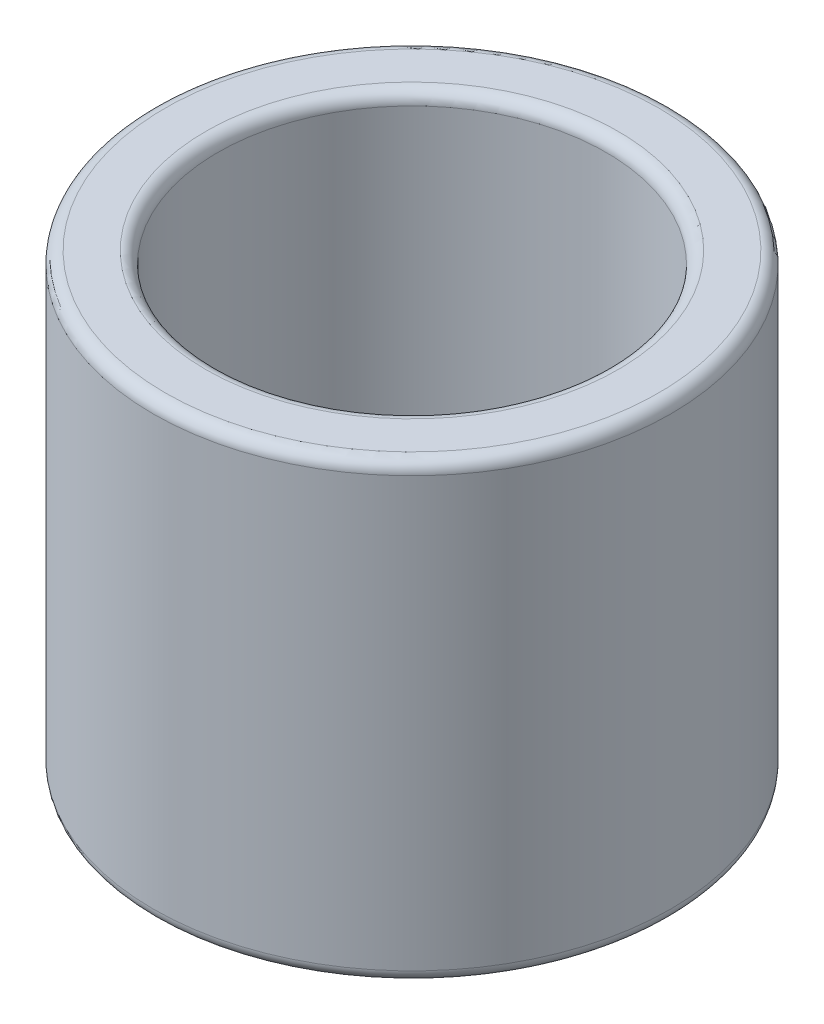
ISO-10303-21;
HEADER;
FILE_DESCRIPTION(('STEP AP214'),'2;1');
FILE_NAME('part.step','',(''),(''),'','','');
FILE_SCHEMA(('AUTOMOTIVE_DESIGN { 1 0 10303 214 1 1 1 1 }'));
ENDSEC;
DATA;
#1=APPLICATION_CONTEXT('core data for automotive mechanical design processes');
#2=APPLICATION_PROTOCOL_DEFINITION('international standard','automotive_design',2000,#1);
#3=PRODUCT_CONTEXT('',#1,'mechanical');
#4=PRODUCT('Part','Part','',(#3));
#5=PRODUCT_RELATED_PRODUCT_CATEGORY('part','',(#4));
#6=PRODUCT_DEFINITION_FORMATION('','',#4);
#7=PRODUCT_DEFINITION_CONTEXT('part definition',#1,'design');
#8=PRODUCT_DEFINITION('design','',#6,#7);
#9=PRODUCT_DEFINITION_SHAPE('','',#8);
#10=(LENGTH_UNIT() NAMED_UNIT(*) SI_UNIT(.MILLI.,.METRE.));
#11=(NAMED_UNIT(*) PLANE_ANGLE_UNIT() SI_UNIT($,.RADIAN.));
#12=(NAMED_UNIT(*) SI_UNIT($,.STERADIAN.) SOLID_ANGLE_UNIT());
#13=UNCERTAINTY_MEASURE_WITH_UNIT(LENGTH_MEASURE(1.E-05),#10,'distance_accuracy_value','');
#14=(GEOMETRIC_REPRESENTATION_CONTEXT(3) GLOBAL_UNCERTAINTY_ASSIGNED_CONTEXT((#13)) GLOBAL_UNIT_ASSIGNED_CONTEXT((#10,
#11,#12)) REPRESENTATION_CONTEXT('',''));
#15=CARTESIAN_POINT('',(0.,0.,0.));
#16=DIRECTION('',(0.,0.,1.));
#17=DIRECTION('',(1.,0.,0.));
#18=AXIS2_PLACEMENT_3D('',#15,#16,#17);
#19=CARTESIAN_POINT('',(0.,14.,0.));
#20=DIRECTION('',(0.,1.,0.));
#21=DIRECTION('',(0.,0.,1.));
#22=AXIS2_PLACEMENT_3D('',#19,#20,#21);
#23=PLANE('',#22);
#24=CARTESIAN_POINT('',(0.,14.,0.));
#25=DIRECTION('',(0.,1.,0.));
#26=DIRECTION('',(0.,0.,1.));
#27=AXIS2_PLACEMENT_3D('',#24,#25,#26);
#28=CIRCLE('',#27,12.75);
#29=CARTESIAN_POINT('',(0.,14.,12.75));
#30=VERTEX_POINT('',#29);
#31=EDGE_CURVE('E10',#30,#30,#28,.F.);
#32=ORIENTED_EDGE('',*,*,#31,.T.);
#33=EDGE_LOOP('',(#32));
#34=FACE_BOUND('',#33,.T.);
#35=CARTESIAN_POINT('',(0.,14.,0.));
#36=DIRECTION('',(0.,1.,0.));
#37=DIRECTION('',(0.,0.,1.));
#38=AXIS2_PLACEMENT_3D('',#35,#36,#37);
#39=CIRCLE('',#38,15.25);
#40=CARTESIAN_POINT('',(0.,14.,15.25));
#41=VERTEX_POINT('',#40);
#42=EDGE_CURVE('E45',#41,#41,#39,.T.);
#43=ORIENTED_EDGE('',*,*,#42,.T.);
#44=EDGE_LOOP('',(#43));
#45=FACE_BOUND('',#44,.T.);
#46=ADVANCED_FACE('F37',(#34,#45),#23,.T.);
#47=CARTESIAN_POINT('',(0.,-14.,0.));
#48=DIRECTION('',(0.,1.,0.));
#49=DIRECTION('',(0.,0.,1.));
#50=AXIS2_PLACEMENT_3D('',#47,#48,#49);
#51=PLANE('',#50);
#52=CARTESIAN_POINT('',(0.,-14.,0.));
#53=DIRECTION('',(0.,1.,0.));
#54=DIRECTION('',(0.,0.,1.));
#55=AXIS2_PLACEMENT_3D('',#52,#53,#54);
#56=CIRCLE('',#55,12.75);
#57=CARTESIAN_POINT('',(0.,-14.,12.75));
#58=VERTEX_POINT('',#57);
#59=EDGE_CURVE('E69',#58,#58,#56,.T.);
#60=ORIENTED_EDGE('',*,*,#59,.T.);
#61=EDGE_LOOP('',(#60));
#62=FACE_BOUND('',#61,.T.);
#63=CARTESIAN_POINT('',(0.,-14.,0.));
#64=DIRECTION('',(0.,1.,0.));
#65=DIRECTION('',(0.,0.,1.));
#66=AXIS2_PLACEMENT_3D('',#63,#64,#65);
#67=CIRCLE('',#66,15.25);
#68=CARTESIAN_POINT('',(0.,-14.,15.25));
#69=VERTEX_POINT('',#68);
#70=EDGE_CURVE('E73',#69,#69,#67,.F.);
#71=ORIENTED_EDGE('',*,*,#70,.T.);
#72=EDGE_LOOP('',(#71));
#73=FACE_BOUND('',#72,.T.);
#74=ADVANCED_FACE('F78',(#62,#73),#51,.F.);
#75=CARTESIAN_POINT('',(0.,14.,0.));
#76=DIRECTION('',(0.,-1.,0.));
#77=DIRECTION('',(0.,0.,-1.));
#78=AXIS2_PLACEMENT_3D('',#75,#76,#77);
#79=CYLINDRICAL_SURFACE('',#78,16.);
#80=CARTESIAN_POINT('',(0.,-13.25,0.));
#81=DIRECTION('',(0.,1.,0.));
#82=DIRECTION('',(0.,0.,1.));
#83=AXIS2_PLACEMENT_3D('',#80,#81,#82);
#84=CIRCLE('',#83,16.);
#85=CARTESIAN_POINT('',(0.,-13.25,16.));
#86=VERTEX_POINT('',#85);
#87=EDGE_CURVE('E50',#86,#86,#84,.T.);
#88=ORIENTED_EDGE('',*,*,#87,.T.);
#89=EDGE_LOOP('',(#88));
#90=FACE_BOUND('',#89,.T.);
#91=CARTESIAN_POINT('',(0.,13.25,0.));
#92=DIRECTION('',(0.,1.,0.));
#93=DIRECTION('',(0.,0.,1.));
#94=AXIS2_PLACEMENT_3D('',#91,#92,#93);
#95=CIRCLE('',#94,16.);
#96=CARTESIAN_POINT('',(0.,13.25,16.));
#97=VERTEX_POINT('',#96);
#98=EDGE_CURVE('E55',#97,#97,#95,.F.);
#99=ORIENTED_EDGE('',*,*,#98,.T.);
#100=EDGE_LOOP('',(#99));
#101=FACE_BOUND('',#100,.T.);
#102=ADVANCED_FACE('F88',(#90,#101),#79,.T.);
#103=CARTESIAN_POINT('',(0.,14.,0.));
#104=DIRECTION('',(0.,-1.,0.));
#105=DIRECTION('',(0.,0.,-1.));
#106=AXIS2_PLACEMENT_3D('',#103,#104,#105);
#107=CYLINDRICAL_SURFACE('',#106,12.);
#108=CARTESIAN_POINT('',(0.,-13.25,0.));
#109=DIRECTION('',(0.,1.,0.));
#110=DIRECTION('',(0.,0.,1.));
#111=AXIS2_PLACEMENT_3D('',#108,#109,#110);
#112=CIRCLE('',#111,12.);
#113=CARTESIAN_POINT('',(0.,-13.25,12.));
#114=VERTEX_POINT('',#113);
#115=EDGE_CURVE('E61',#114,#114,#112,.F.);
#116=ORIENTED_EDGE('',*,*,#115,.T.);
#117=EDGE_LOOP('',(#116));
#118=FACE_BOUND('',#117,.T.);
#119=CARTESIAN_POINT('',(0.,13.25,0.));
#120=DIRECTION('',(0.,1.,0.));
#121=DIRECTION('',(0.,0.,1.));
#122=AXIS2_PLACEMENT_3D('',#119,#120,#121);
#123=CIRCLE('',#122,12.);
#124=CARTESIAN_POINT('',(0.,13.25,12.));
#125=VERTEX_POINT('',#124);
#126=EDGE_CURVE('E65',#125,#125,#123,.T.);
#127=ORIENTED_EDGE('',*,*,#126,.T.);
#128=EDGE_LOOP('',(#127));
#129=FACE_BOUND('',#128,.T.);
#130=ADVANCED_FACE('F91',(#118,#129),#107,.F.);
#131=CARTESIAN_POINT('',(0.,-13.25,0.));
#132=DIRECTION('',(0.,1.,0.));
#133=DIRECTION('',(0.,0.,1.));
#134=AXIS2_PLACEMENT_3D('',#131,#132,#133);
#135=TOROIDAL_SURFACE('',#134,12.75,0.75);
#136=ORIENTED_EDGE('',*,*,#115,.F.);
#137=EDGE_LOOP('',(#136));
#138=FACE_BOUND('',#137,.T.);
#139=ORIENTED_EDGE('',*,*,#59,.F.);
#140=EDGE_LOOP('',(#139));
#141=FACE_BOUND('',#140,.T.);
#142=ADVANCED_FACE('F84',(#138,#141),#135,.T.);
#143=CARTESIAN_POINT('',(0.,-13.25,0.));
#144=DIRECTION('',(0.,1.,0.));
#145=DIRECTION('',(0.,0.,1.));
#146=AXIS2_PLACEMENT_3D('',#143,#144,#145);
#147=TOROIDAL_SURFACE('',#146,15.25,0.75);
#148=ORIENTED_EDGE('',*,*,#70,.F.);
#149=EDGE_LOOP('',(#148));
#150=FACE_BOUND('',#149,.T.);
#151=ORIENTED_EDGE('',*,*,#87,.F.);
#152=EDGE_LOOP('',(#151));
#153=FACE_BOUND('',#152,.T.);
#154=ADVANCED_FACE('F80',(#150,#153),#147,.T.);
#155=CARTESIAN_POINT('',(0.,13.25,0.));
#156=DIRECTION('',(0.,1.,0.));
#157=DIRECTION('',(0.,0.,1.));
#158=AXIS2_PLACEMENT_3D('',#155,#156,#157);
#159=TOROIDAL_SURFACE('',#158,12.75,0.75);
#160=ORIENTED_EDGE('',*,*,#31,.F.);
#161=EDGE_LOOP('',(#160));
#162=FACE_BOUND('',#161,.T.);
#163=ORIENTED_EDGE('',*,*,#126,.F.);
#164=EDGE_LOOP('',(#163));
#165=FACE_BOUND('',#164,.T.);
#166=ADVANCED_FACE('F83',(#162,#165),#159,.T.);
#167=CARTESIAN_POINT('',(0.,13.25,0.));
#168=DIRECTION('',(0.,1.,0.));
#169=DIRECTION('',(0.,0.,1.));
#170=AXIS2_PLACEMENT_3D('',#167,#168,#169);
#171=TOROIDAL_SURFACE('',#170,15.25,0.75);
#172=ORIENTED_EDGE('',*,*,#98,.F.);
#173=EDGE_LOOP('',(#172));
#174=FACE_BOUND('',#173,.T.);
#175=ORIENTED_EDGE('',*,*,#42,.F.);
#176=EDGE_LOOP('',(#175));
#177=FACE_BOUND('',#176,.T.);
#178=ADVANCED_FACE('F39',(#174,#177),#171,.T.);
#179=CLOSED_SHELL('',(#46,#74,#102,#130,#142,#154,#166,#178));
#180=MANIFOLD_SOLID_BREP('B2',#179);
#181=ADVANCED_BREP_SHAPE_REPRESENTATION('',(#18,#180),#14);
#182=SHAPE_DEFINITION_REPRESENTATION(#9,#181);
ENDSEC;
END-ISO-10303-21;
